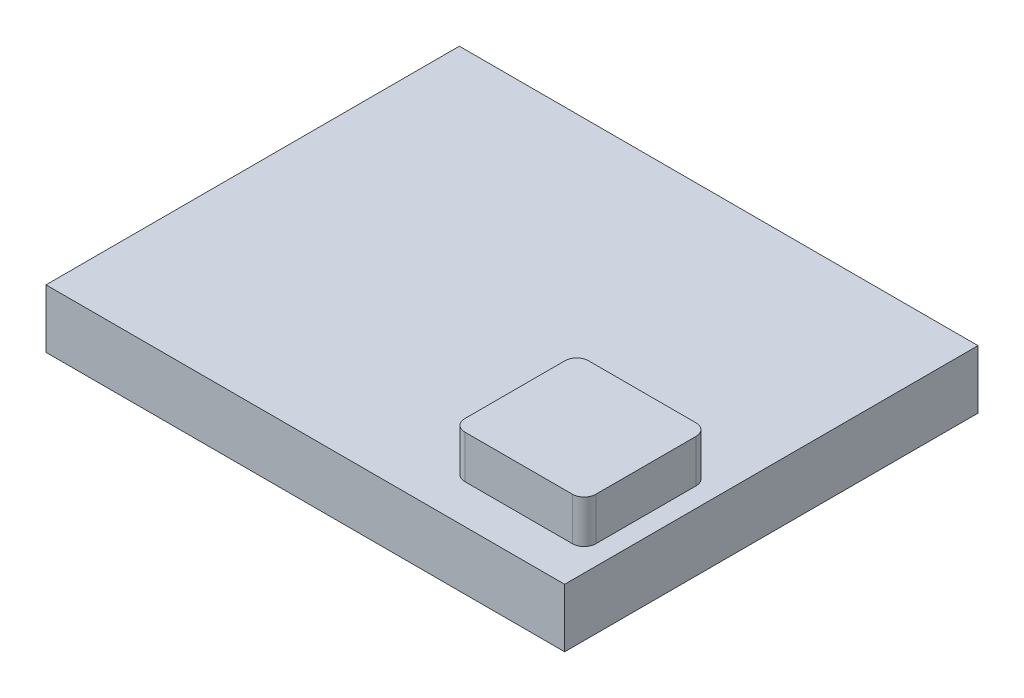
ISO-10303-21;
HEADER;
FILE_DESCRIPTION(('STEP AP214'),'2;1');
FILE_NAME('part.step','',(''),(''),'','','');
FILE_SCHEMA(('AUTOMOTIVE_DESIGN { 1 0 10303 214 1 1 1 1 }'));
ENDSEC;
DATA;
#1=APPLICATION_CONTEXT('core data for automotive mechanical design processes');
#2=APPLICATION_PROTOCOL_DEFINITION('international standard','automotive_design',2000,#1);
#3=PRODUCT_CONTEXT('',#1,'mechanical');
#4=PRODUCT('Part','Part','',(#3));
#5=PRODUCT_RELATED_PRODUCT_CATEGORY('part','',(#4));
#6=PRODUCT_DEFINITION_FORMATION('','',#4);
#7=PRODUCT_DEFINITION_CONTEXT('part definition',#1,'design');
#8=PRODUCT_DEFINITION('design','',#6,#7);
#9=PRODUCT_DEFINITION_SHAPE('','',#8);
#10=(LENGTH_UNIT() NAMED_UNIT(*) SI_UNIT(.MILLI.,.METRE.));
#11=(NAMED_UNIT(*) PLANE_ANGLE_UNIT() SI_UNIT($,.RADIAN.));
#12=(NAMED_UNIT(*) SI_UNIT($,.STERADIAN.) SOLID_ANGLE_UNIT());
#13=UNCERTAINTY_MEASURE_WITH_UNIT(LENGTH_MEASURE(1.E-05),#10,'distance_accuracy_value','');
#14=(GEOMETRIC_REPRESENTATION_CONTEXT(3) GLOBAL_UNCERTAINTY_ASSIGNED_CONTEXT((#13)) GLOBAL_UNIT_ASSIGNED_CONTEXT((#10,
#11,#12)) REPRESENTATION_CONTEXT('',''));
#15=CARTESIAN_POINT('',(0.,0.,0.));
#16=DIRECTION('',(0.,0.,1.));
#17=DIRECTION('',(1.,0.,0.));
#18=AXIS2_PLACEMENT_3D('',#15,#16,#17);
#19=CARTESIAN_POINT('',(6.15,2.6,1.13));
#20=DIRECTION('',(-1.,0.,0.));
#21=DIRECTION('',(0.,0.,1.));
#22=AXIS2_PLACEMENT_3D('',#19,#20,#21);
#23=PLANE('',#22);
#24=DIRECTION('',(0.,0.,-1.));
#25=VECTOR('',#24,1.);
#26=CARTESIAN_POINT('',(6.15,1.5,1.13));
#27=LINE('',#26,#25);
#28=CARTESIAN_POINT('',(6.15,1.5,4.));
#29=VERTEX_POINT('',#28);
#30=CARTESIAN_POINT('',(6.15,1.5,1.43));
#31=VERTEX_POINT('',#30);
#32=EDGE_CURVE('E143',#29,#31,#27,.T.);
#33=ORIENTED_EDGE('',*,*,#32,.T.);
#34=DIRECTION('',(0.,-1.,0.));
#35=VECTOR('',#34,1.);
#36=CARTESIAN_POINT('',(6.15,2.6,1.43));
#37=LINE('',#36,#35);
#38=CARTESIAN_POINT('',(6.15,2.6,1.43));
#39=VERTEX_POINT('',#38);
#40=EDGE_CURVE('E12',#31,#39,#37,.F.);
#41=ORIENTED_EDGE('',*,*,#40,.T.);
#42=DIRECTION('',(0.,0.,-1.));
#43=VECTOR('',#42,1.);
#44=CARTESIAN_POINT('',(6.15,2.6,1.13));
#45=LINE('',#44,#43);
#46=CARTESIAN_POINT('',(6.15,2.6,4.));
#47=VERTEX_POINT('',#46);
#48=EDGE_CURVE('E141',#47,#39,#45,.T.);
#49=ORIENTED_EDGE('',*,*,#48,.F.);
#50=DIRECTION('',(0.,-1.,0.));
#51=VECTOR('',#50,1.);
#52=CARTESIAN_POINT('',(6.15,2.6,4.));
#53=LINE('',#52,#51);
#54=EDGE_CURVE('E55',#47,#29,#53,.T.);
#55=ORIENTED_EDGE('',*,*,#54,.T.);
#56=EDGE_LOOP('',(#33,#41,#49,#55));
#57=FACE_BOUND('',#56,.T.);
#58=ADVANCED_FACE('F47',(#57),#23,.F.);
#59=CARTESIAN_POINT('',(2.79,2.6,1.13));
#60=DIRECTION('',(0.,0.,1.));
#61=DIRECTION('',(1.,0.,0.));
#62=AXIS2_PLACEMENT_3D('',#59,#60,#61);
#63=PLANE('',#62);
#64=DIRECTION('',(-1.,0.,0.));
#65=VECTOR('',#64,1.);
#66=CARTESIAN_POINT('',(2.79,1.5,1.13));
#67=LINE('',#66,#65);
#68=CARTESIAN_POINT('',(5.85,1.5,1.13));
#69=VERTEX_POINT('',#68);
#70=CARTESIAN_POINT('',(3.09,1.5,1.13));
#71=VERTEX_POINT('',#70);
#72=EDGE_CURVE('E139',#69,#71,#67,.T.);
#73=ORIENTED_EDGE('',*,*,#72,.T.);
#74=DIRECTION('',(0.,-1.,0.));
#75=VECTOR('',#74,1.);
#76=CARTESIAN_POINT('',(3.09,2.6,1.13));
#77=LINE('',#76,#75);
#78=CARTESIAN_POINT('',(3.09,2.6,1.13));
#79=VERTEX_POINT('',#78);
#80=EDGE_CURVE('E118',#71,#79,#77,.F.);
#81=ORIENTED_EDGE('',*,*,#80,.T.);
#82=DIRECTION('',(-1.,0.,0.));
#83=VECTOR('',#82,1.);
#84=CARTESIAN_POINT('',(2.79,2.6,1.13));
#85=LINE('',#84,#83);
#86=CARTESIAN_POINT('',(5.85,2.6,1.13));
#87=VERTEX_POINT('',#86);
#88=EDGE_CURVE('E179',#87,#79,#85,.T.);
#89=ORIENTED_EDGE('',*,*,#88,.F.);
#90=DIRECTION('',(0.,-1.,0.));
#91=VECTOR('',#90,1.);
#92=CARTESIAN_POINT('',(5.85,2.6,1.13));
#93=LINE('',#92,#91);
#94=EDGE_CURVE('E123',#87,#69,#93,.T.);
#95=ORIENTED_EDGE('',*,*,#94,.T.);
#96=EDGE_LOOP('',(#73,#81,#89,#95));
#97=FACE_BOUND('',#96,.T.);
#98=ADVANCED_FACE('F189',(#97),#63,.F.);
#99=CARTESIAN_POINT('',(2.79,2.6,1.13));
#100=DIRECTION('',(1.,0.,0.));
#101=DIRECTION('',(0.,0.,-1.));
#102=AXIS2_PLACEMENT_3D('',#99,#100,#101);
#103=PLANE('',#102);
#104=DIRECTION('',(0.,0.,1.));
#105=VECTOR('',#104,1.);
#106=CARTESIAN_POINT('',(2.79,2.6,1.13));
#107=LINE('',#106,#105);
#108=CARTESIAN_POINT('',(2.79,2.6,1.43));
#109=VERTEX_POINT('',#108);
#110=CARTESIAN_POINT('',(2.79,2.6,4.));
#111=VERTEX_POINT('',#110);
#112=EDGE_CURVE('E132',#109,#111,#107,.T.);
#113=ORIENTED_EDGE('',*,*,#112,.F.);
#114=DIRECTION('',(0.,-1.,0.));
#115=VECTOR('',#114,1.);
#116=CARTESIAN_POINT('',(2.79,2.6,1.43));
#117=LINE('',#116,#115);
#118=CARTESIAN_POINT('',(2.79,1.5,1.43));
#119=VERTEX_POINT('',#118);
#120=EDGE_CURVE('E117',#109,#119,#117,.T.);
#121=ORIENTED_EDGE('',*,*,#120,.T.);
#122=DIRECTION('',(0.,0.,1.));
#123=VECTOR('',#122,1.);
#124=CARTESIAN_POINT('',(2.79,1.5,1.13));
#125=LINE('',#124,#123);
#126=CARTESIAN_POINT('',(2.79,1.5,4.));
#127=VERTEX_POINT('',#126);
#128=EDGE_CURVE('E130',#119,#127,#125,.T.);
#129=ORIENTED_EDGE('',*,*,#128,.T.);
#130=DIRECTION('',(0.,-1.,0.));
#131=VECTOR('',#130,1.);
#132=CARTESIAN_POINT('',(2.79,2.6,4.));
#133=LINE('',#132,#131);
#134=EDGE_CURVE('E134',#127,#111,#133,.F.);
#135=ORIENTED_EDGE('',*,*,#134,.T.);
#136=EDGE_LOOP('',(#113,#121,#129,#135));
#137=FACE_BOUND('',#136,.T.);
#138=ADVANCED_FACE('F129',(#137),#103,.F.);
#139=CARTESIAN_POINT('',(2.79,2.6,4.3));
#140=DIRECTION('',(0.,0.,-1.));
#141=DIRECTION('',(-1.,0.,0.));
#142=AXIS2_PLACEMENT_3D('',#139,#140,#141);
#143=PLANE('',#142);
#144=DIRECTION('',(1.,0.,0.));
#145=VECTOR('',#144,1.);
#146=CARTESIAN_POINT('',(2.79,2.6,4.3));
#147=LINE('',#146,#145);
#148=CARTESIAN_POINT('',(3.09,2.6,4.3));
#149=VERTEX_POINT('',#148);
#150=CARTESIAN_POINT('',(5.85,2.6,4.3));
#151=VERTEX_POINT('',#150);
#152=EDGE_CURVE('E147',#149,#151,#147,.T.);
#153=ORIENTED_EDGE('',*,*,#152,.F.);
#154=DIRECTION('',(0.,-1.,0.));
#155=VECTOR('',#154,1.);
#156=CARTESIAN_POINT('',(3.09,2.6,4.3));
#157=LINE('',#156,#155);
#158=CARTESIAN_POINT('',(3.09,1.5,4.3));
#159=VERTEX_POINT('',#158);
#160=EDGE_CURVE('E164',#149,#159,#157,.T.);
#161=ORIENTED_EDGE('',*,*,#160,.T.);
#162=DIRECTION('',(1.,0.,0.));
#163=VECTOR('',#162,1.);
#164=CARTESIAN_POINT('',(2.79,1.5,4.3));
#165=LINE('',#164,#163);
#166=CARTESIAN_POINT('',(5.85,1.5,4.3));
#167=VERTEX_POINT('',#166);
#168=EDGE_CURVE('E138',#159,#167,#165,.T.);
#169=ORIENTED_EDGE('',*,*,#168,.T.);
#170=DIRECTION('',(0.,-1.,0.));
#171=VECTOR('',#170,1.);
#172=CARTESIAN_POINT('',(5.85,2.6,4.3));
#173=LINE('',#172,#171);
#174=EDGE_CURVE('E62',#167,#151,#173,.F.);
#175=ORIENTED_EDGE('',*,*,#174,.T.);
#176=EDGE_LOOP('',(#153,#161,#169,#175));
#177=FACE_BOUND('',#176,.T.);
#178=ADVANCED_FACE('F193',(#177),#143,.F.);
#179=CARTESIAN_POINT('',(0.,2.6,0.));
#180=DIRECTION('',(0.,1.,0.));
#181=DIRECTION('',(0.,0.,1.));
#182=AXIS2_PLACEMENT_3D('',#179,#180,#181);
#183=PLANE('',#182);
#184=ORIENTED_EDGE('',*,*,#88,.T.);
#185=CARTESIAN_POINT('',(3.09,2.6,1.43));
#186=DIRECTION('',(0.,1.,0.));
#187=DIRECTION('',(0.,0.,1.));
#188=AXIS2_PLACEMENT_3D('',#185,#186,#187);
#189=CIRCLE('',#188,0.3);
#190=EDGE_CURVE('E161',#79,#109,#189,.T.);
#191=ORIENTED_EDGE('',*,*,#190,.T.);
#192=ORIENTED_EDGE('',*,*,#112,.T.);
#193=CARTESIAN_POINT('',(3.09,2.6,4.));
#194=DIRECTION('',(0.,1.,0.));
#195=DIRECTION('',(0.,0.,1.));
#196=AXIS2_PLACEMENT_3D('',#193,#194,#195);
#197=CIRCLE('',#196,0.3);
#198=EDGE_CURVE('E69',#111,#149,#197,.T.);
#199=ORIENTED_EDGE('',*,*,#198,.T.);
#200=ORIENTED_EDGE('',*,*,#152,.T.);
#201=CARTESIAN_POINT('',(5.85,2.6,4.));
#202=DIRECTION('',(0.,1.,0.));
#203=DIRECTION('',(0.,0.,1.));
#204=AXIS2_PLACEMENT_3D('',#201,#202,#203);
#205=CIRCLE('',#204,0.3);
#206=EDGE_CURVE('E156',#151,#47,#205,.T.);
#207=ORIENTED_EDGE('',*,*,#206,.T.);
#208=ORIENTED_EDGE('',*,*,#48,.T.);
#209=CARTESIAN_POINT('',(5.85,2.6,1.43));
#210=DIRECTION('',(0.,1.,0.));
#211=DIRECTION('',(0.,0.,1.));
#212=AXIS2_PLACEMENT_3D('',#209,#210,#211);
#213=CIRCLE('',#212,0.3);
#214=EDGE_CURVE('E158',#39,#87,#213,.T.);
#215=ORIENTED_EDGE('',*,*,#214,.T.);
#216=EDGE_LOOP('',(#184,#191,#192,#199,#200,#207,#208,#215));
#217=FACE_BOUND('',#216,.T.);
#218=ADVANCED_FACE('F183',(#217),#183,.T.);
#219=CARTESIAN_POINT('',(0.,1.5,0.));
#220=DIRECTION('',(0.,1.,0.));
#221=DIRECTION('',(0.,0.,1.));
#222=AXIS2_PLACEMENT_3D('',#219,#220,#221);
#223=PLANE('',#222);
#224=ORIENTED_EDGE('',*,*,#128,.F.);
#225=CARTESIAN_POINT('',(3.09,1.5,1.43));
#226=DIRECTION('',(0.,1.,0.));
#227=DIRECTION('',(0.,0.,1.));
#228=AXIS2_PLACEMENT_3D('',#225,#226,#227);
#229=CIRCLE('',#228,0.3);
#230=EDGE_CURVE('E113',#119,#71,#229,.F.);
#231=ORIENTED_EDGE('',*,*,#230,.T.);
#232=ORIENTED_EDGE('',*,*,#72,.F.);
#233=CARTESIAN_POINT('',(5.85,1.5,1.43));
#234=DIRECTION('',(0.,1.,0.));
#235=DIRECTION('',(0.,0.,1.));
#236=AXIS2_PLACEMENT_3D('',#233,#234,#235);
#237=CIRCLE('',#236,0.3);
#238=EDGE_CURVE('E150',#69,#31,#237,.F.);
#239=ORIENTED_EDGE('',*,*,#238,.T.);
#240=ORIENTED_EDGE('',*,*,#32,.F.);
#241=CARTESIAN_POINT('',(5.85,1.5,4.));
#242=DIRECTION('',(0.,1.,0.));
#243=DIRECTION('',(0.,0.,1.));
#244=AXIS2_PLACEMENT_3D('',#241,#242,#243);
#245=CIRCLE('',#244,0.3);
#246=EDGE_CURVE('E133',#29,#167,#245,.F.);
#247=ORIENTED_EDGE('',*,*,#246,.T.);
#248=ORIENTED_EDGE('',*,*,#168,.F.);
#249=CARTESIAN_POINT('',(3.09,1.5,4.));
#250=DIRECTION('',(0.,1.,0.));
#251=DIRECTION('',(0.,0.,1.));
#252=AXIS2_PLACEMENT_3D('',#249,#250,#251);
#253=CIRCLE('',#252,0.3);
#254=EDGE_CURVE('E124',#159,#127,#253,.F.);
#255=ORIENTED_EDGE('',*,*,#254,.T.);
#256=EDGE_LOOP('',(#224,#231,#232,#239,#240,#247,#248,#255));
#257=FACE_BOUND('',#256,.T.);
#258=ADVANCED_FACE('F136',(#257),#223,.F.);
#259=CARTESIAN_POINT('',(3.09,2.6,1.43));
#260=DIRECTION('',(0.,-1.,0.));
#261=DIRECTION('',(0.,0.,-1.));
#262=AXIS2_PLACEMENT_3D('',#259,#260,#261);
#263=CYLINDRICAL_SURFACE('',#262,0.3);
#264=ORIENTED_EDGE('',*,*,#190,.F.);
#265=ORIENTED_EDGE('',*,*,#80,.F.);
#266=ORIENTED_EDGE('',*,*,#230,.F.);
#267=ORIENTED_EDGE('',*,*,#120,.F.);
#268=EDGE_LOOP('',(#264,#265,#266,#267));
#269=FACE_BOUND('',#268,.T.);
#270=ADVANCED_FACE('F116',(#269),#263,.T.);
#271=CARTESIAN_POINT('',(3.09,2.6,4.));
#272=DIRECTION('',(0.,-1.,0.));
#273=DIRECTION('',(0.,0.,-1.));
#274=AXIS2_PLACEMENT_3D('',#271,#272,#273);
#275=CYLINDRICAL_SURFACE('',#274,0.3);
#276=ORIENTED_EDGE('',*,*,#198,.F.);
#277=ORIENTED_EDGE('',*,*,#134,.F.);
#278=ORIENTED_EDGE('',*,*,#254,.F.);
#279=ORIENTED_EDGE('',*,*,#160,.F.);
#280=EDGE_LOOP('',(#276,#277,#278,#279));
#281=FACE_BOUND('',#280,.T.);
#282=ADVANCED_FACE('F192',(#281),#275,.T.);
#283=CARTESIAN_POINT('',(5.85,2.6,1.43));
#284=DIRECTION('',(0.,-1.,0.));
#285=DIRECTION('',(0.,0.,-1.));
#286=AXIS2_PLACEMENT_3D('',#283,#284,#285);
#287=CYLINDRICAL_SURFACE('',#286,0.3);
#288=ORIENTED_EDGE('',*,*,#214,.F.);
#289=ORIENTED_EDGE('',*,*,#40,.F.);
#290=ORIENTED_EDGE('',*,*,#238,.F.);
#291=ORIENTED_EDGE('',*,*,#94,.F.);
#292=EDGE_LOOP('',(#288,#289,#290,#291));
#293=FACE_BOUND('',#292,.T.);
#294=ADVANCED_FACE('F187',(#293),#287,.T.);
#295=CARTESIAN_POINT('',(5.85,2.6,4.));
#296=DIRECTION('',(0.,-1.,0.));
#297=DIRECTION('',(0.,0.,-1.));
#298=AXIS2_PLACEMENT_3D('',#295,#296,#297);
#299=CYLINDRICAL_SURFACE('',#298,0.3);
#300=ORIENTED_EDGE('',*,*,#206,.F.);
#301=ORIENTED_EDGE('',*,*,#174,.F.);
#302=ORIENTED_EDGE('',*,*,#246,.F.);
#303=ORIENTED_EDGE('',*,*,#54,.F.);
#304=EDGE_LOOP('',(#300,#301,#302,#303));
#305=FACE_BOUND('',#304,.T.);
#306=ADVANCED_FACE('F49',(#305),#299,.T.);
#307=CLOSED_SHELL('',(#58,#98,#138,#178,#218,#258,#270,#282,#294,#306));
#308=MANIFOLD_SOLID_BREP('B2',#307);
#309=CARTESIAN_POINT('',(6.65,1.5,5.3));
#310=DIRECTION('',(-1.,0.,0.));
#311=DIRECTION('',(0.,0.,1.));
#312=AXIS2_PLACEMENT_3D('',#309,#310,#311);
#313=PLANE('',#312);
#314=DIRECTION('',(0.,0.,-1.));
#315=VECTOR('',#314,1.);
#316=CARTESIAN_POINT('',(6.65,0.,5.3));
#317=LINE('',#316,#315);
#318=CARTESIAN_POINT('',(6.65,0.,5.3));
#319=VERTEX_POINT('',#318);
#320=CARTESIAN_POINT('',(6.65,0.,-5.3));
#321=VERTEX_POINT('',#320);
#322=EDGE_CURVE('E338',#319,#321,#317,.T.);
#323=ORIENTED_EDGE('',*,*,#322,.T.);
#324=DIRECTION('',(0.,-1.,0.));
#325=VECTOR('',#324,1.);
#326=CARTESIAN_POINT('',(6.65,1.5,-5.3));
#327=LINE('',#326,#325);
#328=CARTESIAN_POINT('',(6.65,1.5,-5.3));
#329=VERTEX_POINT('',#328);
#330=EDGE_CURVE('E45',#329,#321,#327,.T.);
#331=ORIENTED_EDGE('',*,*,#330,.F.);
#332=DIRECTION('',(0.,0.,-1.));
#333=VECTOR('',#332,1.);
#334=CARTESIAN_POINT('',(6.65,1.5,5.3));
#335=LINE('',#334,#333);
#336=CARTESIAN_POINT('',(6.65,1.5,5.3));
#337=VERTEX_POINT('',#336);
#338=EDGE_CURVE('E326',#337,#329,#335,.T.);
#339=ORIENTED_EDGE('',*,*,#338,.F.);
#340=DIRECTION('',(0.,-1.,0.));
#341=VECTOR('',#340,1.);
#342=CARTESIAN_POINT('',(6.65,1.5,5.3));
#343=LINE('',#342,#341);
#344=EDGE_CURVE('E334',#337,#319,#343,.T.);
#345=ORIENTED_EDGE('',*,*,#344,.T.);
#346=EDGE_LOOP('',(#323,#331,#339,#345));
#347=FACE_BOUND('',#346,.T.);
#348=ADVANCED_FACE('F275',(#347),#313,.F.);
#349=CARTESIAN_POINT('',(-6.65,1.5,-5.3));
#350=DIRECTION('',(0.,0.,1.));
#351=DIRECTION('',(1.,0.,0.));
#352=AXIS2_PLACEMENT_3D('',#349,#350,#351);
#353=PLANE('',#352);
#354=DIRECTION('',(-1.,0.,0.));
#355=VECTOR('',#354,1.);
#356=CARTESIAN_POINT('',(-6.65,0.,-5.3));
#357=LINE('',#356,#355);
#358=CARTESIAN_POINT('',(-6.65,0.,-5.3));
#359=VERTEX_POINT('',#358);
#360=EDGE_CURVE('E330',#321,#359,#357,.T.);
#361=ORIENTED_EDGE('',*,*,#360,.T.);
#362=DIRECTION('',(0.,-1.,0.));
#363=VECTOR('',#362,1.);
#364=CARTESIAN_POINT('',(-6.65,1.5,-5.3));
#365=LINE('',#364,#363);
#366=CARTESIAN_POINT('',(-6.65,1.5,-5.3));
#367=VERTEX_POINT('',#366);
#368=EDGE_CURVE('E283',#367,#359,#365,.T.);
#369=ORIENTED_EDGE('',*,*,#368,.F.);
#370=DIRECTION('',(-1.,0.,0.));
#371=VECTOR('',#370,1.);
#372=CARTESIAN_POINT('',(-6.65,1.5,-5.3));
#373=LINE('',#372,#371);
#374=EDGE_CURVE('E321',#329,#367,#373,.T.);
#375=ORIENTED_EDGE('',*,*,#374,.F.);
#376=ORIENTED_EDGE('',*,*,#330,.T.);
#377=EDGE_LOOP('',(#361,#369,#375,#376));
#378=FACE_BOUND('',#377,.T.);
#379=ADVANCED_FACE('F329',(#378),#353,.F.);
#380=CARTESIAN_POINT('',(-6.65,1.5,5.3));
#381=DIRECTION('',(1.,0.,0.));
#382=DIRECTION('',(0.,0.,-1.));
#383=AXIS2_PLACEMENT_3D('',#380,#381,#382);
#384=PLANE('',#383);
#385=DIRECTION('',(0.,0.,1.));
#386=VECTOR('',#385,1.);
#387=CARTESIAN_POINT('',(-6.65,0.,5.3));
#388=LINE('',#387,#386);
#389=CARTESIAN_POINT('',(-6.65,0.,5.3));
#390=VERTEX_POINT('',#389);
#391=EDGE_CURVE('E308',#359,#390,#388,.T.);
#392=ORIENTED_EDGE('',*,*,#391,.T.);
#393=DIRECTION('',(0.,-1.,0.));
#394=VECTOR('',#393,1.);
#395=CARTESIAN_POINT('',(-6.65,1.5,5.3));
#396=LINE('',#395,#394);
#397=CARTESIAN_POINT('',(-6.65,1.5,5.3));
#398=VERTEX_POINT('',#397);
#399=EDGE_CURVE('E331',#398,#390,#396,.T.);
#400=ORIENTED_EDGE('',*,*,#399,.F.);
#401=DIRECTION('',(0.,0.,1.));
#402=VECTOR('',#401,1.);
#403=CARTESIAN_POINT('',(-6.65,1.5,5.3));
#404=LINE('',#403,#402);
#405=EDGE_CURVE('E324',#367,#398,#404,.T.);
#406=ORIENTED_EDGE('',*,*,#405,.F.);
#407=ORIENTED_EDGE('',*,*,#368,.T.);
#408=EDGE_LOOP('',(#392,#400,#406,#407));
#409=FACE_BOUND('',#408,.T.);
#410=ADVANCED_FACE('F332',(#409),#384,.F.);
#411=CARTESIAN_POINT('',(-6.65,1.5,5.3));
#412=DIRECTION('',(0.,0.,-1.));
#413=DIRECTION('',(-1.,0.,0.));
#414=AXIS2_PLACEMENT_3D('',#411,#412,#413);
#415=PLANE('',#414);
#416=DIRECTION('',(1.,0.,0.));
#417=VECTOR('',#416,1.);
#418=CARTESIAN_POINT('',(-6.65,0.,5.3));
#419=LINE('',#418,#417);
#420=EDGE_CURVE('E314',#390,#319,#419,.T.);
#421=ORIENTED_EDGE('',*,*,#420,.T.);
#422=ORIENTED_EDGE('',*,*,#344,.F.);
#423=DIRECTION('',(1.,0.,0.));
#424=VECTOR('',#423,1.);
#425=CARTESIAN_POINT('',(-6.65,1.5,5.3));
#426=LINE('',#425,#424);
#427=EDGE_CURVE('E291',#398,#337,#426,.T.);
#428=ORIENTED_EDGE('',*,*,#427,.F.);
#429=ORIENTED_EDGE('',*,*,#399,.T.);
#430=EDGE_LOOP('',(#421,#422,#428,#429));
#431=FACE_BOUND('',#430,.T.);
#432=ADVANCED_FACE('F345',(#431),#415,.F.);
#433=CARTESIAN_POINT('',(0.,1.5,0.));
#434=DIRECTION('',(0.,-1.,0.));
#435=DIRECTION('',(0.,0.,-1.));
#436=AXIS2_PLACEMENT_3D('',#433,#434,#435);
#437=PLANE('',#436);
#438=ORIENTED_EDGE('',*,*,#338,.T.);
#439=ORIENTED_EDGE('',*,*,#374,.T.);
#440=ORIENTED_EDGE('',*,*,#405,.T.);
#441=ORIENTED_EDGE('',*,*,#427,.T.);
#442=EDGE_LOOP('',(#438,#439,#440,#441));
#443=FACE_BOUND('',#442,.T.);
#444=ADVANCED_FACE('F322',(#443),#437,.F.);
#445=CARTESIAN_POINT('',(0.,0.,0.));
#446=DIRECTION('',(0.,-1.,0.));
#447=DIRECTION('',(0.,0.,-1.));
#448=AXIS2_PLACEMENT_3D('',#445,#446,#447);
#449=PLANE('',#448);
#450=ORIENTED_EDGE('',*,*,#322,.F.);
#451=ORIENTED_EDGE('',*,*,#420,.F.);
#452=ORIENTED_EDGE('',*,*,#391,.F.);
#453=ORIENTED_EDGE('',*,*,#360,.F.);
#454=EDGE_LOOP('',(#450,#451,#452,#453));
#455=FACE_BOUND('',#454,.T.);
#456=ADVANCED_FACE('F348',(#455),#449,.T.);
#457=CLOSED_SHELL('',(#348,#379,#410,#432,#444,#456));
#458=MANIFOLD_SOLID_BREP('B6',#457);
#459=ADVANCED_BREP_SHAPE_REPRESENTATION('',(#18,#308,#458),#14);
#460=SHAPE_DEFINITION_REPRESENTATION(#9,#459);
ENDSEC;
END-ISO-10303-21;
